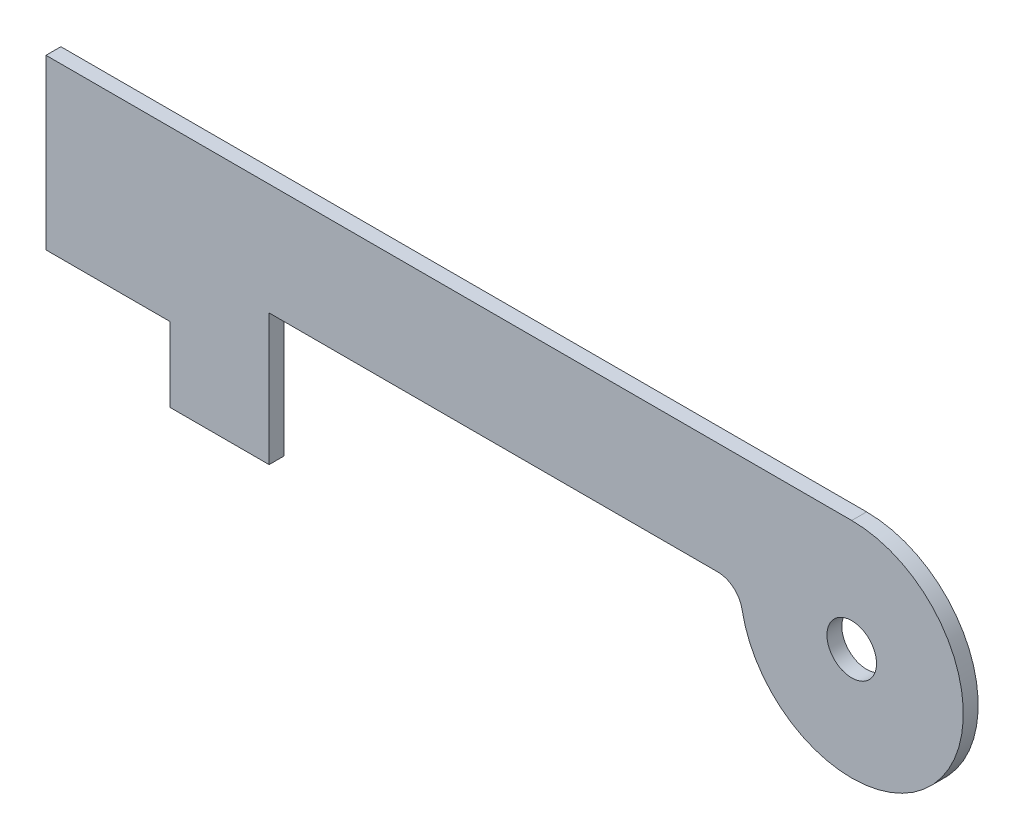
ISO-10303-21;
HEADER;
FILE_DESCRIPTION(('STEP AP214'),'2;1');
FILE_NAME('part.step','',(''),(''),'','','');
FILE_SCHEMA(('AUTOMOTIVE_DESIGN { 1 0 10303 214 1 1 1 1 }'));
ENDSEC;
DATA;
#1=APPLICATION_CONTEXT('core data for automotive mechanical design processes');
#2=APPLICATION_PROTOCOL_DEFINITION('international standard','automotive_design',2000,#1);
#3=PRODUCT_CONTEXT('',#1,'mechanical');
#4=PRODUCT('Part','Part','',(#3));
#5=PRODUCT_RELATED_PRODUCT_CATEGORY('part','',(#4));
#6=PRODUCT_DEFINITION_FORMATION('','',#4);
#7=PRODUCT_DEFINITION_CONTEXT('part definition',#1,'design');
#8=PRODUCT_DEFINITION('design','',#6,#7);
#9=PRODUCT_DEFINITION_SHAPE('','',#8);
#10=(LENGTH_UNIT() NAMED_UNIT(*) SI_UNIT(.MILLI.,.METRE.));
#11=(NAMED_UNIT(*) PLANE_ANGLE_UNIT() SI_UNIT($,.RADIAN.));
#12=(NAMED_UNIT(*) SI_UNIT($,.STERADIAN.) SOLID_ANGLE_UNIT());
#13=UNCERTAINTY_MEASURE_WITH_UNIT(LENGTH_MEASURE(1.E-05),#10,'distance_accuracy_value','');
#14=(GEOMETRIC_REPRESENTATION_CONTEXT(3) GLOBAL_UNCERTAINTY_ASSIGNED_CONTEXT((#13)) GLOBAL_UNIT_ASSIGNED_CONTEXT((#10,
#11,#12)) REPRESENTATION_CONTEXT('',''));
#15=CARTESIAN_POINT('',(0.,0.,0.));
#16=DIRECTION('',(0.,0.,1.));
#17=DIRECTION('',(1.,0.,0.));
#18=AXIS2_PLACEMENT_3D('',#15,#16,#17);
#19=CARTESIAN_POINT('',(0.,0.,3.));
#20=DIRECTION('',(0.,0.,-1.));
#21=DIRECTION('',(-1.,0.,0.));
#22=AXIS2_PLACEMENT_3D('',#19,#20,#21);
#23=CYLINDRICAL_SURFACE('',#22,22.5);
#24=CARTESIAN_POINT('',(0.,0.,0.));
#25=DIRECTION('',(0.,0.,1.));
#26=DIRECTION('',(1.,0.,0.));
#27=AXIS2_PLACEMENT_3D('',#24,#25,#26);
#28=CIRCLE('',#27,22.5);
#29=CARTESIAN_POINT('',(-22.1249737358018,-4.09090909090909,0.));
#30=VERTEX_POINT('',#29);
#31=CARTESIAN_POINT('',(0.,22.5,0.));
#32=VERTEX_POINT('',#31);
#33=EDGE_CURVE('E423',#30,#32,#28,.T.);
#34=ORIENTED_EDGE('',*,*,#33,.T.);
#35=DIRECTION('',(0.,0.,-1.));
#36=VECTOR('',#35,1.);
#37=CARTESIAN_POINT('',(0.,22.5,3.));
#38=LINE('',#37,#36);
#39=CARTESIAN_POINT('',(0.,22.5,3.));
#40=VERTEX_POINT('',#39);
#41=EDGE_CURVE('E253',#40,#32,#38,.T.);
#42=ORIENTED_EDGE('',*,*,#41,.F.);
#43=CARTESIAN_POINT('',(0.,0.,3.));
#44=DIRECTION('',(0.,0.,1.));
#45=DIRECTION('',(1.,0.,0.));
#46=AXIS2_PLACEMENT_3D('',#43,#44,#45);
#47=CIRCLE('',#46,22.5);
#48=CARTESIAN_POINT('',(-22.1249737358018,-4.09090909090909,3.));
#49=VERTEX_POINT('',#48);
#50=EDGE_CURVE('E436',#49,#40,#47,.T.);
#51=ORIENTED_EDGE('',*,*,#50,.F.);
#52=DIRECTION('',(0.,0.,-1.));
#53=VECTOR('',#52,1.);
#54=CARTESIAN_POINT('',(-22.1249737358018,-4.09090909090909,3.));
#55=LINE('',#54,#53);
#56=EDGE_CURVE('E12',#49,#30,#55,.T.);
#57=ORIENTED_EDGE('',*,*,#56,.T.);
#58=EDGE_LOOP('',(#34,#42,#51,#57));
#59=FACE_BOUND('',#58,.T.);
#60=ADVANCED_FACE('F242',(#59),#23,.T.);
#61=CARTESIAN_POINT('',(0.,0.,0.));
#62=DIRECTION('',(0.,0.,1.));
#63=DIRECTION('',(1.,0.,0.));
#64=AXIS2_PLACEMENT_3D('',#61,#62,#63);
#65=PLANE('',#64);
#66=DIRECTION('',(1.,0.,0.));
#67=VECTOR('',#66,1.);
#68=CARTESIAN_POINT('',(-22.5,22.5,0.));
#69=LINE('',#68,#67);
#70=CARTESIAN_POINT('',(-162.5,22.5,0.));
#71=VERTEX_POINT('',#70);
#72=EDGE_CURVE('E322',#71,#32,#69,.T.);
#73=ORIENTED_EDGE('',*,*,#72,.T.);
#74=ORIENTED_EDGE('',*,*,#33,.F.);
#75=CARTESIAN_POINT('',(-27.0416345659799,-5.,0.));
#76=DIRECTION('',(0.,0.,-1.));
#77=DIRECTION('',(-1.,0.,0.));
#78=AXIS2_PLACEMENT_3D('',#75,#76,#77);
#79=CIRCLE('',#78,5.);
#80=CARTESIAN_POINT('',(-27.0416345659799,0.,0.));
#81=VERTEX_POINT('',#80);
#82=EDGE_CURVE('E246',#81,#30,#79,.T.);
#83=ORIENTED_EDGE('',*,*,#82,.F.);
#84=DIRECTION('',(-1.,0.,0.));
#85=VECTOR('',#84,1.);
#86=CARTESIAN_POINT('',(-22.5,0.,0.));
#87=LINE('',#86,#85);
#88=CARTESIAN_POINT('',(-117.5,0.,0.));
#89=VERTEX_POINT('',#88);
#90=EDGE_CURVE('E320',#81,#89,#87,.T.);
#91=ORIENTED_EDGE('',*,*,#90,.T.);
#92=DIRECTION('',(0.,-1.,0.));
#93=VECTOR('',#92,1.);
#94=CARTESIAN_POINT('',(-117.5,0.,0.));
#95=LINE('',#94,#93);
#96=CARTESIAN_POINT('',(-117.5,-26.5,0.));
#97=VERTEX_POINT('',#96);
#98=EDGE_CURVE('E361',#89,#97,#95,.T.);
#99=ORIENTED_EDGE('',*,*,#98,.T.);
#100=DIRECTION('',(1.,0.,0.));
#101=VECTOR('',#100,1.);
#102=CARTESIAN_POINT('',(-137.5,-26.5,0.));
#103=LINE('',#102,#101);
#104=CARTESIAN_POINT('',(-137.5,-26.5,0.));
#105=VERTEX_POINT('',#104);
#106=EDGE_CURVE('E357',#105,#97,#103,.T.);
#107=ORIENTED_EDGE('',*,*,#106,.F.);
#108=DIRECTION('',(0.,-1.,0.));
#109=VECTOR('',#108,1.);
#110=CARTESIAN_POINT('',(-137.5,-11.5,0.));
#111=LINE('',#110,#109);
#112=CARTESIAN_POINT('',(-137.5,-11.5,0.));
#113=VERTEX_POINT('',#112);
#114=EDGE_CURVE('E354',#113,#105,#111,.T.);
#115=ORIENTED_EDGE('',*,*,#114,.F.);
#116=DIRECTION('',(-1.,0.,0.));
#117=VECTOR('',#116,1.);
#118=CARTESIAN_POINT('',(-137.5,-11.5,0.));
#119=LINE('',#118,#117);
#120=CARTESIAN_POINT('',(-162.5,-11.5,0.));
#121=VERTEX_POINT('',#120);
#122=EDGE_CURVE('E350',#113,#121,#119,.T.);
#123=ORIENTED_EDGE('',*,*,#122,.T.);
#124=DIRECTION('',(0.,-1.,0.));
#125=VECTOR('',#124,1.);
#126=CARTESIAN_POINT('',(-162.5,22.5,0.));
#127=LINE('',#126,#125);
#128=EDGE_CURVE('E330',#71,#121,#127,.T.);
#129=ORIENTED_EDGE('',*,*,#128,.F.);
#130=EDGE_LOOP('',(#73,#74,#83,#91,#99,#107,#115,#123,#129));
#131=FACE_BOUND('',#130,.T.);
#132=CARTESIAN_POINT('',(0.,0.,0.));
#133=DIRECTION('',(0.,0.,1.));
#134=DIRECTION('',(1.,0.,0.));
#135=AXIS2_PLACEMENT_3D('',#132,#133,#134);
#136=CIRCLE('',#135,5.);
#137=CARTESIAN_POINT('',(5.,0.,0.));
#138=VERTEX_POINT('',#137);
#139=EDGE_CURVE('E425',#138,#138,#136,.F.);
#140=ORIENTED_EDGE('',*,*,#139,.F.);
#141=EDGE_LOOP('',(#140));
#142=FACE_BOUND('',#141,.T.);
#143=ADVANCED_FACE('F396',(#131,#142),#65,.F.);
#144=CARTESIAN_POINT('',(0.,0.,3.));
#145=DIRECTION('',(0.,0.,1.));
#146=DIRECTION('',(1.,0.,0.));
#147=AXIS2_PLACEMENT_3D('',#144,#145,#146);
#148=PLANE('',#147);
#149=CARTESIAN_POINT('',(-27.0416345659799,-5.,3.));
#150=DIRECTION('',(0.,0.,-1.));
#151=DIRECTION('',(-1.,0.,0.));
#152=AXIS2_PLACEMENT_3D('',#149,#150,#151);
#153=CIRCLE('',#152,5.);
#154=CARTESIAN_POINT('',(-27.0416345659799,0.,3.));
#155=VERTEX_POINT('',#154);
#156=EDGE_CURVE('E326',#155,#49,#153,.T.);
#157=ORIENTED_EDGE('',*,*,#156,.T.);
#158=ORIENTED_EDGE('',*,*,#50,.T.);
#159=DIRECTION('',(1.,0.,0.));
#160=VECTOR('',#159,1.);
#161=CARTESIAN_POINT('',(-22.5,22.5,3.));
#162=LINE('',#161,#160);
#163=CARTESIAN_POINT('',(-162.5,22.5,3.));
#164=VERTEX_POINT('',#163);
#165=EDGE_CURVE('E390',#164,#40,#162,.T.);
#166=ORIENTED_EDGE('',*,*,#165,.F.);
#167=DIRECTION('',(0.,-1.,0.));
#168=VECTOR('',#167,1.);
#169=CARTESIAN_POINT('',(-162.5,22.5,3.));
#170=LINE('',#169,#168);
#171=CARTESIAN_POINT('',(-162.5,-11.5,3.));
#172=VERTEX_POINT('',#171);
#173=EDGE_CURVE('E366',#164,#172,#170,.T.);
#174=ORIENTED_EDGE('',*,*,#173,.T.);
#175=DIRECTION('',(-1.,0.,0.));
#176=VECTOR('',#175,1.);
#177=CARTESIAN_POINT('',(-137.5,-11.5,3.));
#178=LINE('',#177,#176);
#179=CARTESIAN_POINT('',(-137.5,-11.5,3.));
#180=VERTEX_POINT('',#179);
#181=EDGE_CURVE('E406',#180,#172,#178,.T.);
#182=ORIENTED_EDGE('',*,*,#181,.F.);
#183=DIRECTION('',(0.,-1.,0.));
#184=VECTOR('',#183,1.);
#185=CARTESIAN_POINT('',(-137.5,-11.5,3.));
#186=LINE('',#185,#184);
#187=CARTESIAN_POINT('',(-137.5,-26.5,3.));
#188=VERTEX_POINT('',#187);
#189=EDGE_CURVE('E408',#180,#188,#186,.T.);
#190=ORIENTED_EDGE('',*,*,#189,.T.);
#191=DIRECTION('',(1.,0.,0.));
#192=VECTOR('',#191,1.);
#193=CARTESIAN_POINT('',(-137.5,-26.5,3.));
#194=LINE('',#193,#192);
#195=CARTESIAN_POINT('',(-117.5,-26.5,3.));
#196=VERTEX_POINT('',#195);
#197=EDGE_CURVE('E343',#188,#196,#194,.T.);
#198=ORIENTED_EDGE('',*,*,#197,.T.);
#199=DIRECTION('',(0.,-1.,0.));
#200=VECTOR('',#199,1.);
#201=CARTESIAN_POINT('',(-117.5,0.,3.));
#202=LINE('',#201,#200);
#203=CARTESIAN_POINT('',(-117.5,0.,3.));
#204=VERTEX_POINT('',#203);
#205=EDGE_CURVE('E335',#204,#196,#202,.T.);
#206=ORIENTED_EDGE('',*,*,#205,.F.);
#207=DIRECTION('',(-1.,0.,0.));
#208=VECTOR('',#207,1.);
#209=CARTESIAN_POINT('',(-22.5,0.,3.));
#210=LINE('',#209,#208);
#211=EDGE_CURVE('E318',#155,#204,#210,.T.);
#212=ORIENTED_EDGE('',*,*,#211,.F.);
#213=EDGE_LOOP('',(#157,#158,#166,#174,#182,#190,#198,#206,#212));
#214=FACE_BOUND('',#213,.T.);
#215=CARTESIAN_POINT('',(0.,0.,3.));
#216=DIRECTION('',(0.,0.,1.));
#217=DIRECTION('',(1.,0.,0.));
#218=AXIS2_PLACEMENT_3D('',#215,#216,#217);
#219=CIRCLE('',#218,5.);
#220=CARTESIAN_POINT('',(5.,0.,3.));
#221=VERTEX_POINT('',#220);
#222=EDGE_CURVE('E428',#221,#221,#219,.T.);
#223=ORIENTED_EDGE('',*,*,#222,.F.);
#224=EDGE_LOOP('',(#223));
#225=FACE_BOUND('',#224,.T.);
#226=ADVANCED_FACE('F332',(#214,#225),#148,.T.);
#227=CARTESIAN_POINT('',(-162.5,22.5,3.));
#228=DIRECTION('',(1.,0.,0.));
#229=DIRECTION('',(0.,0.,-1.));
#230=AXIS2_PLACEMENT_3D('',#227,#228,#229);
#231=PLANE('',#230);
#232=ORIENTED_EDGE('',*,*,#128,.T.);
#233=DIRECTION('',(0.,0.,-1.));
#234=VECTOR('',#233,1.);
#235=CARTESIAN_POINT('',(-162.5,-11.5,3.));
#236=LINE('',#235,#234);
#237=EDGE_CURVE('E377',#172,#121,#236,.T.);
#238=ORIENTED_EDGE('',*,*,#237,.F.);
#239=ORIENTED_EDGE('',*,*,#173,.F.);
#240=DIRECTION('',(0.,0.,-1.));
#241=VECTOR('',#240,1.);
#242=CARTESIAN_POINT('',(-162.5,22.5,3.));
#243=LINE('',#242,#241);
#244=EDGE_CURVE('E323',#164,#71,#243,.T.);
#245=ORIENTED_EDGE('',*,*,#244,.T.);
#246=EDGE_LOOP('',(#232,#238,#239,#245));
#247=FACE_BOUND('',#246,.T.);
#248=ADVANCED_FACE('F385',(#247),#231,.F.);
#249=CARTESIAN_POINT('',(-137.5,-11.5,3.));
#250=DIRECTION('',(0.,-1.,0.));
#251=DIRECTION('',(1.,0.,0.));
#252=AXIS2_PLACEMENT_3D('',#249,#250,#251);
#253=PLANE('',#252);
#254=ORIENTED_EDGE('',*,*,#122,.F.);
#255=DIRECTION('',(0.,0.,-1.));
#256=VECTOR('',#255,1.);
#257=CARTESIAN_POINT('',(-137.5,-11.5,3.));
#258=LINE('',#257,#256);
#259=EDGE_CURVE('E374',#180,#113,#258,.T.);
#260=ORIENTED_EDGE('',*,*,#259,.F.);
#261=ORIENTED_EDGE('',*,*,#181,.T.);
#262=ORIENTED_EDGE('',*,*,#237,.T.);
#263=EDGE_LOOP('',(#254,#260,#261,#262));
#264=FACE_BOUND('',#263,.T.);
#265=ADVANCED_FACE('F402',(#264),#253,.T.);
#266=CARTESIAN_POINT('',(-137.5,-11.5,3.));
#267=DIRECTION('',(1.,0.,0.));
#268=DIRECTION('',(0.,0.,-1.));
#269=AXIS2_PLACEMENT_3D('',#266,#267,#268);
#270=PLANE('',#269);
#271=ORIENTED_EDGE('',*,*,#114,.T.);
#272=DIRECTION('',(0.,0.,-1.));
#273=VECTOR('',#272,1.);
#274=CARTESIAN_POINT('',(-137.5,-26.5,3.));
#275=LINE('',#274,#273);
#276=EDGE_CURVE('E370',#188,#105,#275,.T.);
#277=ORIENTED_EDGE('',*,*,#276,.F.);
#278=ORIENTED_EDGE('',*,*,#189,.F.);
#279=ORIENTED_EDGE('',*,*,#259,.T.);
#280=EDGE_LOOP('',(#271,#277,#278,#279));
#281=FACE_BOUND('',#280,.T.);
#282=ADVANCED_FACE('F457',(#281),#270,.F.);
#283=CARTESIAN_POINT('',(-137.5,-26.5,3.));
#284=DIRECTION('',(0.,1.,0.));
#285=DIRECTION('',(-1.,0.,0.));
#286=AXIS2_PLACEMENT_3D('',#283,#284,#285);
#287=PLANE('',#286);
#288=ORIENTED_EDGE('',*,*,#106,.T.);
#289=DIRECTION('',(0.,0.,-1.));
#290=VECTOR('',#289,1.);
#291=CARTESIAN_POINT('',(-117.5,-26.5,3.));
#292=LINE('',#291,#290);
#293=EDGE_CURVE('E341',#196,#97,#292,.T.);
#294=ORIENTED_EDGE('',*,*,#293,.F.);
#295=ORIENTED_EDGE('',*,*,#197,.F.);
#296=ORIENTED_EDGE('',*,*,#276,.T.);
#297=EDGE_LOOP('',(#288,#294,#295,#296));
#298=FACE_BOUND('',#297,.T.);
#299=ADVANCED_FACE('F419',(#298),#287,.F.);
#300=CARTESIAN_POINT('',(-117.5,0.,3.));
#301=DIRECTION('',(1.,0.,0.));
#302=DIRECTION('',(0.,0.,-1.));
#303=AXIS2_PLACEMENT_3D('',#300,#301,#302);
#304=PLANE('',#303);
#305=ORIENTED_EDGE('',*,*,#98,.F.);
#306=DIRECTION('',(0.,0.,-1.));
#307=VECTOR('',#306,1.);
#308=CARTESIAN_POINT('',(-117.5,0.,3.));
#309=LINE('',#308,#307);
#310=EDGE_CURVE('E337',#204,#89,#309,.T.);
#311=ORIENTED_EDGE('',*,*,#310,.F.);
#312=ORIENTED_EDGE('',*,*,#205,.T.);
#313=ORIENTED_EDGE('',*,*,#293,.T.);
#314=EDGE_LOOP('',(#305,#311,#312,#313));
#315=FACE_BOUND('',#314,.T.);
#316=ADVANCED_FACE('F422',(#315),#304,.T.);
#317=CARTESIAN_POINT('',(-22.5,0.,3.));
#318=DIRECTION('',(0.,-1.,0.));
#319=DIRECTION('',(1.,0.,0.));
#320=AXIS2_PLACEMENT_3D('',#317,#318,#319);
#321=PLANE('',#320);
#322=DIRECTION('',(0.,0.,-1.));
#323=VECTOR('',#322,1.);
#324=CARTESIAN_POINT('',(-27.0416345659799,0.,3.));
#325=LINE('',#324,#323);
#326=EDGE_CURVE('E311',#155,#81,#325,.T.);
#327=ORIENTED_EDGE('',*,*,#326,.F.);
#328=ORIENTED_EDGE('',*,*,#211,.T.);
#329=ORIENTED_EDGE('',*,*,#310,.T.);
#330=ORIENTED_EDGE('',*,*,#90,.F.);
#331=EDGE_LOOP('',(#327,#328,#329,#330));
#332=FACE_BOUND('',#331,.T.);
#333=ADVANCED_FACE('F315',(#332),#321,.T.);
#334=CARTESIAN_POINT('',(-22.5,22.5,3.));
#335=DIRECTION('',(0.,1.,0.));
#336=DIRECTION('',(0.,0.,1.));
#337=AXIS2_PLACEMENT_3D('',#334,#335,#336);
#338=PLANE('',#337);
#339=ORIENTED_EDGE('',*,*,#72,.F.);
#340=ORIENTED_EDGE('',*,*,#244,.F.);
#341=ORIENTED_EDGE('',*,*,#165,.T.);
#342=ORIENTED_EDGE('',*,*,#41,.T.);
#343=EDGE_LOOP('',(#339,#340,#341,#342));
#344=FACE_BOUND('',#343,.T.);
#345=ADVANCED_FACE('F389',(#344),#338,.T.);
#346=CARTESIAN_POINT('',(-27.0416345659799,-5.,3.));
#347=DIRECTION('',(0.,0.,-1.));
#348=DIRECTION('',(-1.,0.,0.));
#349=AXIS2_PLACEMENT_3D('',#346,#347,#348);
#350=CYLINDRICAL_SURFACE('',#349,5.);
#351=ORIENTED_EDGE('',*,*,#82,.T.);
#352=ORIENTED_EDGE('',*,*,#56,.F.);
#353=ORIENTED_EDGE('',*,*,#156,.F.);
#354=ORIENTED_EDGE('',*,*,#326,.T.);
#355=EDGE_LOOP('',(#351,#352,#353,#354));
#356=FACE_BOUND('',#355,.T.);
#357=ADVANCED_FACE('F244',(#356),#350,.F.);
#358=CARTESIAN_POINT('',(0.,0.,-63.6396103067893));
#359=DIRECTION('',(0.,0.,1.));
#360=DIRECTION('',(1.,0.,0.));
#361=AXIS2_PLACEMENT_3D('',#358,#359,#360);
#362=CYLINDRICAL_SURFACE('',#361,5.);
#363=ORIENTED_EDGE('',*,*,#139,.T.);
#364=EDGE_LOOP('',(#363));
#365=FACE_BOUND('',#364,.T.);
#366=ORIENTED_EDGE('',*,*,#222,.T.);
#367=EDGE_LOOP('',(#366));
#368=FACE_BOUND('',#367,.T.);
#369=ADVANCED_FACE('F453',(#365,#368),#362,.F.);
#370=CLOSED_SHELL('',(#60,#143,#226,#248,#265,#282,#299,#316,#333,#345,#357,#369));
#371=MANIFOLD_SOLID_BREP('B2',#370);
#372=ADVANCED_BREP_SHAPE_REPRESENTATION('',(#18,#371),#14);
#373=SHAPE_DEFINITION_REPRESENTATION(#9,#372);
ENDSEC;
END-ISO-10303-21;
